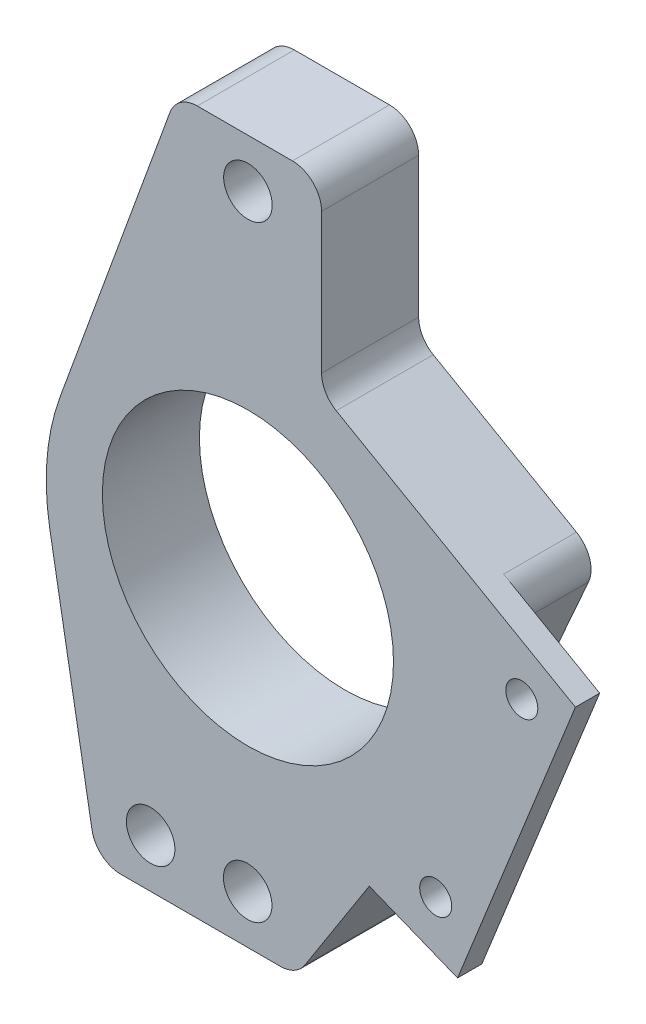
ISO-10303-21;
HEADER;
FILE_DESCRIPTION(('STEP AP214'),'2;1');
FILE_NAME('part.step','',(''),(''),'','','');
FILE_SCHEMA(('AUTOMOTIVE_DESIGN { 1 0 10303 214 1 1 1 1 }'));
ENDSEC;
DATA;
#1=APPLICATION_CONTEXT('core data for automotive mechanical design processes');
#2=APPLICATION_PROTOCOL_DEFINITION('international standard','automotive_design',2000,#1);
#3=PRODUCT_CONTEXT('',#1,'mechanical');
#4=PRODUCT('Part','Part','',(#3));
#5=PRODUCT_RELATED_PRODUCT_CATEGORY('part','',(#4));
#6=PRODUCT_DEFINITION_FORMATION('','',#4);
#7=PRODUCT_DEFINITION_CONTEXT('part definition',#1,'design');
#8=PRODUCT_DEFINITION('design','',#6,#7);
#9=PRODUCT_DEFINITION_SHAPE('','',#8);
#10=(LENGTH_UNIT() NAMED_UNIT(*) SI_UNIT(.MILLI.,.METRE.));
#11=(NAMED_UNIT(*) PLANE_ANGLE_UNIT() SI_UNIT($,.RADIAN.));
#12=(NAMED_UNIT(*) SI_UNIT($,.STERADIAN.) SOLID_ANGLE_UNIT());
#13=UNCERTAINTY_MEASURE_WITH_UNIT(LENGTH_MEASURE(1.E-05),#10,'distance_accuracy_value','');
#14=(GEOMETRIC_REPRESENTATION_CONTEXT(3) GLOBAL_UNCERTAINTY_ASSIGNED_CONTEXT((#13)) GLOBAL_UNIT_ASSIGNED_CONTEXT((#10,
#11,#12)) REPRESENTATION_CONTEXT('',''));
#15=CARTESIAN_POINT('',(0.,0.,0.));
#16=DIRECTION('',(0.,0.,1.));
#17=DIRECTION('',(1.,0.,0.));
#18=AXIS2_PLACEMENT_3D('',#15,#16,#17);
#19=CARTESIAN_POINT('',(7.90346383785839,-4.16941549529396,0.));
#20=DIRECTION('',(0.,0.,1.));
#21=DIRECTION('',(1.,0.,0.));
#22=AXIS2_PLACEMENT_3D('',#19,#20,#21);
#23=PLANE('',#22);
#24=CARTESIAN_POINT('',(-25.4616736797526,-71.0751817515198,0.));
#25=DIRECTION('',(0.,0.,1.));
#26=DIRECTION('',(1.,0.,0.));
#27=AXIS2_PLACEMENT_3D('',#24,#25,#26);
#28=CIRCLE('',#27,6.35);
#29=CARTESIAN_POINT('',(-19.1116736797526,-71.0751817515198,0.));
#30=VERTEX_POINT('',#29);
#31=EDGE_CURVE('E357',#30,#30,#28,.T.);
#32=ORIENTED_EDGE('',*,*,#31,.T.);
#33=EDGE_LOOP('',(#32));
#34=FACE_BOUND('',#33,.T.);
#35=CARTESIAN_POINT('',(0.,87.6652233679311,0.));
#36=DIRECTION('',(0.,0.,1.));
#37=DIRECTION('',(1.,0.,0.));
#38=AXIS2_PLACEMENT_3D('',#35,#36,#37);
#39=CIRCLE('',#38,6.35);
#40=CARTESIAN_POINT('',(6.35,87.6652233679311,0.));
#41=VERTEX_POINT('',#40);
#42=EDGE_CURVE('E351',#41,#41,#39,.T.);
#43=ORIENTED_EDGE('',*,*,#42,.T.);
#44=EDGE_LOOP('',(#43));
#45=FACE_BOUND('',#44,.T.);
#46=CARTESIAN_POINT('',(-0.0616736797525768,-71.0860387192995,0.));
#47=DIRECTION('',(0.,0.,1.));
#48=DIRECTION('',(1.,0.,0.));
#49=AXIS2_PLACEMENT_3D('',#46,#47,#48);
#50=CIRCLE('',#49,6.34999999999999);
#51=CARTESIAN_POINT('',(6.28832632024742,-71.0860387192995,0.));
#52=VERTEX_POINT('',#51);
#53=EDGE_CURVE('E345',#52,#52,#50,.T.);
#54=ORIENTED_EDGE('',*,*,#53,.T.);
#55=EDGE_LOOP('',(#54));
#56=FACE_BOUND('',#55,.T.);
#57=CARTESIAN_POINT('',(0.,0.,0.));
#58=DIRECTION('',(0.,0.,1.));
#59=DIRECTION('',(1.,0.,0.));
#60=AXIS2_PLACEMENT_3D('',#57,#58,#59);
#61=CIRCLE('',#60,38.1);
#62=CARTESIAN_POINT('',(38.1,0.,0.));
#63=VERTEX_POINT('',#62);
#64=EDGE_CURVE('E339',#63,#63,#61,.T.);
#65=ORIENTED_EDGE('',*,*,#64,.T.);
#66=EDGE_LOOP('',(#65));
#67=FACE_BOUND('',#66,.T.);
#68=DIRECTION('',(0.539157704533403,0.842204826418296,0.));
#69=VECTOR('',#68,1.);
#70=CARTESIAN_POINT('',(31.7648995327675,-53.9549633524326,0.));
#71=LINE('',#70,#69);
#72=CARTESIAN_POINT('',(14.9158651693663,-80.274420427844,0.));
#73=VERTEX_POINT('',#72);
#74=CARTESIAN_POINT('',(31.7648995327675,-53.9549633524326,0.));
#75=VERTEX_POINT('',#74);
#76=EDGE_CURVE('E274',#73,#75,#71,.T.);
#77=ORIENTED_EDGE('',*,*,#76,.F.);
#78=CARTESIAN_POINT('',(8.49826439205887,-76.1660387192995,0.));
#79=DIRECTION('',(0.,0.,1.));
#80=DIRECTION('',(1.,0.,0.));
#81=AXIS2_PLACEMENT_3D('',#78,#79,#80);
#82=CIRCLE('',#81,7.62);
#83=CARTESIAN_POINT('',(8.49826439205888,-83.7860387192995,0.));
#84=VERTEX_POINT('',#83);
#85=EDGE_CURVE('E207',#73,#84,#82,.F.);
#86=ORIENTED_EDGE('',*,*,#85,.T.);
#87=DIRECTION('',(1.,0.,0.));
#88=VECTOR('',#87,1.);
#89=CARTESIAN_POINT('',(12.667818141103,-83.7860387192995,0.));
#90=LINE('',#89,#88);
#91=CARTESIAN_POINT('',(-33.3079382069516,-83.7860387192995,0.));
#92=VERTEX_POINT('',#91);
#93=EDGE_CURVE('E292',#92,#84,#90,.T.);
#94=ORIENTED_EDGE('',*,*,#93,.F.);
#95=CARTESIAN_POINT('',(-33.3079382069516,-76.1660387192995,0.));
#96=DIRECTION('',(0.,0.,1.));
#97=DIRECTION('',(1.,0.,0.));
#98=AXIS2_PLACEMENT_3D('',#95,#96,#97);
#99=CIRCLE('',#98,7.62);
#100=CARTESIAN_POINT('',(-40.8125426825424,-77.4871411623152,0.));
#101=VERTEX_POINT('',#100);
#102=EDGE_CURVE('E205',#92,#101,#99,.F.);
#103=ORIENTED_EDGE('',*,*,#102,.T.);
#104=DIRECTION('',(0.173373024017816,-0.984856230392496,0.));
#105=VECTOR('',#104,1.);
#106=CARTESIAN_POINT('',(-39.7036915794758,-83.7860387192995,0.));
#107=LINE('',#106,#105);
#108=CARTESIAN_POINT('',(-51.8670455244235,-14.6913512209726,0.));
#109=VERTEX_POINT('',#108);
#110=EDGE_CURVE('E289',#109,#101,#107,.T.);
#111=ORIENTED_EDGE('',*,*,#110,.F.);
#112=CARTESIAN_POINT('',(7.90346383785839,-4.16941549529396,0.));
#113=DIRECTION('',(0.,0.,1.));
#114=DIRECTION('',(1.,0.,0.));
#115=AXIS2_PLACEMENT_3D('',#112,#113,#114);
#116=CIRCLE('',#115,60.6895783544584);
#117=CARTESIAN_POINT('',(-49.113541670535,16.6220732368237,0.));
#118=VERTEX_POINT('',#117);
#119=EDGE_CURVE('E287',#118,#109,#116,.T.);
#120=ORIENTED_EDGE('',*,*,#119,.F.);
#121=DIRECTION('',(-0.342587463875341,-0.939485939008915,0.));
#122=VECTOR('',#121,1.);
#123=CARTESIAN_POINT('',(-49.113541670535,16.6220732368237,0.));
#124=LINE('',#123,#122);
#125=CARTESIAN_POINT('',(-20.4029819440583,95.3557398426612,0.));
#126=VERTEX_POINT('',#125);
#127=EDGE_CURVE('E285',#126,#118,#124,.T.);
#128=ORIENTED_EDGE('',*,*,#127,.F.);
#129=CARTESIAN_POINT('',(-13.2440990888104,92.7452233679311,0.));
#130=DIRECTION('',(0.,0.,1.));
#131=DIRECTION('',(1.,0.,0.));
#132=AXIS2_PLACEMENT_3D('',#129,#130,#131);
#133=CIRCLE('',#132,7.62);
#134=CARTESIAN_POINT('',(-13.2440990888104,100.365223367931,0.));
#135=VERTEX_POINT('',#134);
#136=EDGE_CURVE('E203',#126,#135,#133,.F.);
#137=ORIENTED_EDGE('',*,*,#136,.T.);
#138=DIRECTION('',(-1.,0.,0.));
#139=VECTOR('',#138,1.);
#140=CARTESIAN_POINT('',(-18.576252894704,100.365223367931,0.));
#141=LINE('',#140,#139);
#142=CARTESIAN_POINT('',(11.6612552260416,100.365223367931,0.));
#143=VERTEX_POINT('',#142);
#144=EDGE_CURVE('E276',#143,#135,#141,.T.);
#145=ORIENTED_EDGE('',*,*,#144,.F.);
#146=CARTESIAN_POINT('',(11.6612552260416,92.7452233679311,0.));
#147=DIRECTION('',(0.,0.,1.));
#148=DIRECTION('',(1.,0.,0.));
#149=AXIS2_PLACEMENT_3D('',#146,#147,#148);
#150=CIRCLE('',#149,7.62);
#151=CARTESIAN_POINT('',(19.2812552260416,92.7452233679311,0.));
#152=VERTEX_POINT('',#151);
#153=EDGE_CURVE('E201',#143,#152,#150,.F.);
#154=ORIENTED_EDGE('',*,*,#153,.T.);
#155=DIRECTION('',(0.,1.,0.));
#156=VECTOR('',#155,1.);
#157=CARTESIAN_POINT('',(19.2812552260416,100.365223367931,0.));
#158=LINE('',#157,#156);
#159=CARTESIAN_POINT('',(19.2812552260416,56.077457914331,0.));
#160=VERTEX_POINT('',#159);
#161=EDGE_CURVE('E271',#160,#152,#158,.T.);
#162=ORIENTED_EDGE('',*,*,#161,.F.);
#163=CARTESIAN_POINT('',(26.9012552260416,56.077457914331,0.));
#164=DIRECTION('',(0.,0.,1.));
#165=DIRECTION('',(1.,0.,0.));
#166=AXIS2_PLACEMENT_3D('',#163,#164,#165);
#167=CIRCLE('',#166,7.62);
#168=CARTESIAN_POINT('',(23.1114699051771,49.4667145959318,0.));
#169=VERTEX_POINT('',#168);
#170=EDGE_CURVE('E242',#160,#169,#167,.T.);
#171=ORIENTED_EDGE('',*,*,#170,.T.);
#172=DIRECTION('',(-0.867551616587824,0.497347154969096,0.));
#173=VECTOR('',#172,1.);
#174=CARTESIAN_POINT('',(19.2812552260416,51.662487547265,0.));
#175=LINE('',#174,#173);
#176=CARTESIAN_POINT('',(60.5795381289079,27.9871429174736,0.));
#177=VERTEX_POINT('',#176);
#178=EDGE_CURVE('E270',#177,#169,#175,.T.);
#179=ORIENTED_EDGE('',*,*,#178,.F.);
#180=CARTESIAN_POINT('',(56.7897528080434,21.3763995990744,0.));
#181=DIRECTION('',(0.,0.,1.));
#182=DIRECTION('',(1.,0.,0.));
#183=AXIS2_PLACEMENT_3D('',#180,#181,#182);
#184=CIRCLE('',#183,7.62);
#185=CARTESIAN_POINT('',(63.7571802893151,18.2910545141253,0.));
#186=VERTEX_POINT('',#185);
#187=EDGE_CURVE('E199',#177,#186,#184,.F.);
#188=ORIENTED_EDGE('',*,*,#187,.T.);
#189=DIRECTION('',(-0.404900929783348,-0.914360561846682,0.));
#190=VECTOR('',#189,1.);
#191=CARTESIAN_POINT('',(66.5381774907985,24.5711936212473,0.));
#192=LINE('',#191,#190);
#193=EDGE_CURVE('E167',#186,#75,#192,.T.);
#194=ORIENTED_EDGE('',*,*,#193,.T.);
#195=EDGE_LOOP('',(#77,#86,#94,#103,#111,#120,#128,#137,#145,#154,#162,#171,#179,#188,#194));
#196=FACE_BOUND('',#195,.T.);
#197=ADVANCED_FACE('F36',(#34,#45,#56,#67,#196),#23,.F.);
#198=CARTESIAN_POINT('',(54.8677317003082,-63.2338089373352,25.4));
#199=DIRECTION('',(0.372696151552018,0.927953435587323,0.));
#200=DIRECTION('',(-0.927953435587323,0.372696151552018,0.));
#201=AXIS2_PLACEMENT_3D('',#198,#199,#200);
#202=PLANE('',#201);
#203=DIRECTION('',(-0.927953435587323,0.372696151552018,0.));
#204=VECTOR('',#203,1.);
#205=CARTESIAN_POINT('',(54.8677317003082,-63.2338089373352,19.05));
#206=LINE('',#205,#204);
#207=CARTESIAN_POINT('',(54.8677317003082,-63.2338089373352,19.05));
#208=VERTEX_POINT('',#207);
#209=CARTESIAN_POINT('',(31.7648995327675,-53.9549633524326,19.05));
#210=VERTEX_POINT('',#209);
#211=EDGE_CURVE('E162',#208,#210,#206,.T.);
#212=ORIENTED_EDGE('',*,*,#211,.F.);
#213=DIRECTION('',(0.,0.,-1.));
#214=VECTOR('',#213,1.);
#215=CARTESIAN_POINT('',(54.8677317003082,-63.2338089373352,25.4));
#216=LINE('',#215,#214);
#217=CARTESIAN_POINT('',(54.8677317003082,-63.2338089373352,25.4));
#218=VERTEX_POINT('',#217);
#219=EDGE_CURVE('E174',#218,#208,#216,.T.);
#220=ORIENTED_EDGE('',*,*,#219,.F.);
#221=DIRECTION('',(0.927953435587323,-0.372696151552018,0.));
#222=VECTOR('',#221,1.);
#223=CARTESIAN_POINT('',(54.8677317003082,-63.2338089373352,25.4));
#224=LINE('',#223,#222);
#225=CARTESIAN_POINT('',(31.7648995327675,-53.9549633524326,25.4));
#226=VERTEX_POINT('',#225);
#227=EDGE_CURVE('E336',#226,#218,#224,.T.);
#228=ORIENTED_EDGE('',*,*,#227,.F.);
#229=DIRECTION('',(0.,0.,-1.));
#230=VECTOR('',#229,1.);
#231=CARTESIAN_POINT('',(31.7648995327675,-53.9549633524326,25.4));
#232=LINE('',#231,#230);
#233=EDGE_CURVE('E177',#226,#210,#232,.T.);
#234=ORIENTED_EDGE('',*,*,#233,.T.);
#235=EDGE_LOOP('',(#212,#220,#228,#234));
#236=FACE_BOUND('',#235,.T.);
#237=ADVANCED_FACE('F172',(#236),#202,.F.);
#238=CARTESIAN_POINT('',(85.7171686846696,13.5763242404886,25.4));
#239=DIRECTION('',(-0.927953435587323,0.372696151552017,0.));
#240=DIRECTION('',(-0.372696151552017,-0.927953435587323,0.));
#241=AXIS2_PLACEMENT_3D('',#238,#239,#240);
#242=PLANE('',#241);
#243=DIRECTION('',(-0.372696151552017,-0.927953435587323,0.));
#244=VECTOR('',#243,1.);
#245=CARTESIAN_POINT('',(85.7171686846696,13.5763242404886,19.05));
#246=LINE('',#245,#244);
#247=CARTESIAN_POINT('',(85.7171686846696,13.5763242404886,19.05));
#248=VERTEX_POINT('',#247);
#249=EDGE_CURVE('E159',#248,#208,#246,.T.);
#250=ORIENTED_EDGE('',*,*,#249,.F.);
#251=DIRECTION('',(0.,0.,-1.));
#252=VECTOR('',#251,1.);
#253=CARTESIAN_POINT('',(85.7171686846696,13.5763242404886,25.4));
#254=LINE('',#253,#252);
#255=CARTESIAN_POINT('',(85.7171686846696,13.5763242404886,25.4));
#256=VERTEX_POINT('',#255);
#257=EDGE_CURVE('E182',#256,#248,#254,.T.);
#258=ORIENTED_EDGE('',*,*,#257,.F.);
#259=DIRECTION('',(0.372696151552017,0.927953435587323,0.));
#260=VECTOR('',#259,1.);
#261=CARTESIAN_POINT('',(85.7171686846696,13.5763242404886,25.4));
#262=LINE('',#261,#260);
#263=EDGE_CURVE('E181',#218,#256,#262,.T.);
#264=ORIENTED_EDGE('',*,*,#263,.F.);
#265=ORIENTED_EDGE('',*,*,#219,.T.);
#266=EDGE_LOOP('',(#250,#258,#264,#265));
#267=FACE_BOUND('',#266,.T.);
#268=ADVANCED_FACE('F180',(#267),#242,.F.);
#269=CARTESIAN_POINT('',(19.2812552260416,51.662487547265,25.4));
#270=DIRECTION('',(-0.497347154969096,-0.867551616587824,0.));
#271=DIRECTION('',(0.867551616587824,-0.497347154969096,0.));
#272=AXIS2_PLACEMENT_3D('',#269,#270,#271);
#273=PLANE('',#272);
#274=ORIENTED_EDGE('',*,*,#178,.T.);
#275=DIRECTION('',(0.,0.,-1.));
#276=VECTOR('',#275,1.);
#277=CARTESIAN_POINT('',(23.1114699051771,49.4667145959318,25.4));
#278=LINE('',#277,#276);
#279=CARTESIAN_POINT('',(23.1114699051771,49.4667145959318,25.4));
#280=VERTEX_POINT('',#279);
#281=EDGE_CURVE('E239',#169,#280,#278,.F.);
#282=ORIENTED_EDGE('',*,*,#281,.T.);
#283=DIRECTION('',(-0.867551616587824,0.497347154969096,0.));
#284=VECTOR('',#283,1.);
#285=CARTESIAN_POINT('',(19.2812552260416,51.662487547265,25.4));
#286=LINE('',#285,#284);
#287=EDGE_CURVE('E254',#256,#280,#286,.T.);
#288=ORIENTED_EDGE('',*,*,#287,.F.);
#289=ORIENTED_EDGE('',*,*,#257,.T.);
#290=DIRECTION('',(-0.867551616587824,0.497347154969096,0.));
#291=VECTOR('',#290,1.);
#292=CARTESIAN_POINT('',(85.7171686846696,13.5763242404886,19.05));
#293=LINE('',#292,#291);
#294=CARTESIAN_POINT('',(60.5795381289079,27.9871429174736,19.05));
#295=VERTEX_POINT('',#294);
#296=EDGE_CURVE('E59',#248,#295,#293,.T.);
#297=ORIENTED_EDGE('',*,*,#296,.T.);
#298=DIRECTION('',(0.,0.,-1.));
#299=VECTOR('',#298,1.);
#300=CARTESIAN_POINT('',(60.5795381289079,27.9871429174736,0.));
#301=LINE('',#300,#299);
#302=EDGE_CURVE('E237',#295,#177,#301,.T.);
#303=ORIENTED_EDGE('',*,*,#302,.T.);
#304=EDGE_LOOP('',(#274,#282,#288,#289,#297,#303));
#305=FACE_BOUND('',#304,.T.);
#306=ADVANCED_FACE('F272',(#305),#273,.F.);
#307=CARTESIAN_POINT('',(7.90346383785839,-4.16941549529396,25.4));
#308=DIRECTION('',(0.,0.,1.));
#309=DIRECTION('',(1.,0.,0.));
#310=AXIS2_PLACEMENT_3D('',#307,#308,#309);
#311=PLANE('',#310);
#312=CARTESIAN_POINT('',(71.679164995877,8.36184835054589,25.4));
#313=DIRECTION('',(0.,0.,1.));
#314=DIRECTION('',(1.,0.,0.));
#315=AXIS2_PLACEMENT_3D('',#312,#313,#314);
#316=CIRCLE('',#315,4.191);
#317=CARTESIAN_POINT('',(75.870164995877,8.36184835054589,25.4));
#318=VERTEX_POINT('',#317);
#319=EDGE_CURVE('E194',#318,#318,#316,.T.);
#320=ORIENTED_EDGE('',*,*,#319,.F.);
#321=EDGE_LOOP('',(#320));
#322=FACE_BOUND('',#321,.T.);
#323=CARTESIAN_POINT('',(49.1489372422544,-47.7347927375789,25.4));
#324=DIRECTION('',(0.,0.,1.));
#325=DIRECTION('',(1.,0.,0.));
#326=AXIS2_PLACEMENT_3D('',#323,#324,#325);
#327=CIRCLE('',#326,4.191);
#328=CARTESIAN_POINT('',(53.3399372422544,-47.7347927375789,25.4));
#329=VERTEX_POINT('',#328);
#330=EDGE_CURVE('E368',#329,#329,#327,.T.);
#331=ORIENTED_EDGE('',*,*,#330,.F.);
#332=EDGE_LOOP('',(#331));
#333=FACE_BOUND('',#332,.T.);
#334=CARTESIAN_POINT('',(0.,87.6652233679311,25.4));
#335=DIRECTION('',(0.,0.,1.));
#336=DIRECTION('',(1.,0.,0.));
#337=AXIS2_PLACEMENT_3D('',#334,#335,#336);
#338=CIRCLE('',#337,6.35);
#339=CARTESIAN_POINT('',(6.35,87.6652233679311,25.4));
#340=VERTEX_POINT('',#339);
#341=EDGE_CURVE('E348',#340,#340,#338,.T.);
#342=ORIENTED_EDGE('',*,*,#341,.F.);
#343=EDGE_LOOP('',(#342));
#344=FACE_BOUND('',#343,.T.);
#345=CARTESIAN_POINT('',(0.,0.,25.4));
#346=DIRECTION('',(0.,0.,1.));
#347=DIRECTION('',(1.,0.,0.));
#348=AXIS2_PLACEMENT_3D('',#345,#346,#347);
#349=CIRCLE('',#348,38.1);
#350=CARTESIAN_POINT('',(38.1,0.,25.4));
#351=VERTEX_POINT('',#350);
#352=EDGE_CURVE('E279',#351,#351,#349,.T.);
#353=ORIENTED_EDGE('',*,*,#352,.F.);
#354=EDGE_LOOP('',(#353));
#355=FACE_BOUND('',#354,.T.);
#356=DIRECTION('',(1.,0.,0.));
#357=VECTOR('',#356,1.);
#358=CARTESIAN_POINT('',(12.667818141103,-83.7860387192995,25.4));
#359=LINE('',#358,#357);
#360=CARTESIAN_POINT('',(-33.3079382069516,-83.7860387192995,25.4));
#361=VERTEX_POINT('',#360);
#362=CARTESIAN_POINT('',(8.49826439205888,-83.7860387192995,25.4));
#363=VERTEX_POINT('',#362);
#364=EDGE_CURVE('E298',#361,#363,#359,.T.);
#365=ORIENTED_EDGE('',*,*,#364,.T.);
#366=CARTESIAN_POINT('',(8.49826439205887,-76.1660387192995,25.4));
#367=DIRECTION('',(0.,0.,1.));
#368=DIRECTION('',(1.,0.,0.));
#369=AXIS2_PLACEMENT_3D('',#366,#367,#368);
#370=CIRCLE('',#369,7.62);
#371=CARTESIAN_POINT('',(14.9158651693663,-80.274420427844,25.4));
#372=VERTEX_POINT('',#371);
#373=EDGE_CURVE('E220',#363,#372,#370,.T.);
#374=ORIENTED_EDGE('',*,*,#373,.T.);
#375=DIRECTION('',(0.539157704533403,0.842204826418296,0.));
#376=VECTOR('',#375,1.);
#377=CARTESIAN_POINT('',(31.7648995327675,-53.9549633524326,25.4));
#378=LINE('',#377,#376);
#379=EDGE_CURVE('E295',#372,#226,#378,.T.);
#380=ORIENTED_EDGE('',*,*,#379,.T.);
#381=ORIENTED_EDGE('',*,*,#227,.T.);
#382=ORIENTED_EDGE('',*,*,#263,.T.);
#383=ORIENTED_EDGE('',*,*,#287,.T.);
#384=CARTESIAN_POINT('',(26.9012552260416,56.077457914331,25.4));
#385=DIRECTION('',(0.,0.,1.));
#386=DIRECTION('',(1.,0.,0.));
#387=AXIS2_PLACEMENT_3D('',#384,#385,#386);
#388=CIRCLE('',#387,7.62);
#389=CARTESIAN_POINT('',(19.2812552260416,56.077457914331,25.4));
#390=VERTEX_POINT('',#389);
#391=EDGE_CURVE('E44',#280,#390,#388,.F.);
#392=ORIENTED_EDGE('',*,*,#391,.T.);
#393=DIRECTION('',(0.,1.,0.));
#394=VECTOR('',#393,1.);
#395=CARTESIAN_POINT('',(19.2812552260416,100.365223367931,25.4));
#396=LINE('',#395,#394);
#397=CARTESIAN_POINT('',(19.2812552260416,92.7452233679311,25.4));
#398=VERTEX_POINT('',#397);
#399=EDGE_CURVE('E251',#390,#398,#396,.T.);
#400=ORIENTED_EDGE('',*,*,#399,.T.);
#401=CARTESIAN_POINT('',(11.6612552260416,92.7452233679311,25.4));
#402=DIRECTION('',(0.,0.,1.));
#403=DIRECTION('',(1.,0.,0.));
#404=AXIS2_PLACEMENT_3D('',#401,#402,#403);
#405=CIRCLE('',#404,7.62);
#406=CARTESIAN_POINT('',(11.6612552260416,100.365223367931,25.4));
#407=VERTEX_POINT('',#406);
#408=EDGE_CURVE('E214',#398,#407,#405,.T.);
#409=ORIENTED_EDGE('',*,*,#408,.T.);
#410=DIRECTION('',(-1.,0.,0.));
#411=VECTOR('',#410,1.);
#412=CARTESIAN_POINT('',(-18.576252894704,100.365223367931,25.4));
#413=LINE('',#412,#411);
#414=CARTESIAN_POINT('',(-13.2440990888104,100.365223367931,25.4));
#415=VERTEX_POINT('',#414);
#416=EDGE_CURVE('E263',#407,#415,#413,.T.);
#417=ORIENTED_EDGE('',*,*,#416,.T.);
#418=CARTESIAN_POINT('',(-13.2440990888104,92.7452233679311,25.4));
#419=DIRECTION('',(0.,0.,1.));
#420=DIRECTION('',(1.,0.,0.));
#421=AXIS2_PLACEMENT_3D('',#418,#419,#420);
#422=CIRCLE('',#421,7.62);
#423=CARTESIAN_POINT('',(-20.4029819440583,95.3557398426612,25.4));
#424=VERTEX_POINT('',#423);
#425=EDGE_CURVE('E216',#415,#424,#422,.T.);
#426=ORIENTED_EDGE('',*,*,#425,.T.);
#427=DIRECTION('',(-0.342587463875341,-0.939485939008915,0.));
#428=VECTOR('',#427,1.);
#429=CARTESIAN_POINT('',(-49.113541670535,16.6220732368237,25.4));
#430=LINE('',#429,#428);
#431=CARTESIAN_POINT('',(-49.113541670535,16.6220732368237,25.4));
#432=VERTEX_POINT('',#431);
#433=EDGE_CURVE('E330',#424,#432,#430,.T.);
#434=ORIENTED_EDGE('',*,*,#433,.T.);
#435=CARTESIAN_POINT('',(7.90346383785839,-4.16941549529396,25.4));
#436=DIRECTION('',(0.,0.,1.));
#437=DIRECTION('',(1.,0.,0.));
#438=AXIS2_PLACEMENT_3D('',#435,#436,#437);
#439=CIRCLE('',#438,60.6895783544584);
#440=CARTESIAN_POINT('',(-51.8670455244235,-14.6913512209726,25.4));
#441=VERTEX_POINT('',#440);
#442=EDGE_CURVE('E306',#432,#441,#439,.T.);
#443=ORIENTED_EDGE('',*,*,#442,.T.);
#444=DIRECTION('',(0.173373024017816,-0.984856230392496,0.));
#445=VECTOR('',#444,1.);
#446=CARTESIAN_POINT('',(-39.7036915794758,-83.7860387192995,25.4));
#447=LINE('',#446,#445);
#448=CARTESIAN_POINT('',(-40.8125426825424,-77.4871411623152,25.4));
#449=VERTEX_POINT('',#448);
#450=EDGE_CURVE('E323',#441,#449,#447,.T.);
#451=ORIENTED_EDGE('',*,*,#450,.T.);
#452=CARTESIAN_POINT('',(-33.3079382069516,-76.1660387192995,25.4));
#453=DIRECTION('',(0.,0.,1.));
#454=DIRECTION('',(1.,0.,0.));
#455=AXIS2_PLACEMENT_3D('',#452,#453,#454);
#456=CIRCLE('',#455,7.62);
#457=EDGE_CURVE('E218',#449,#361,#456,.T.);
#458=ORIENTED_EDGE('',*,*,#457,.T.);
#459=EDGE_LOOP('',(#365,#374,#380,#381,#382,#383,#392,#400,#409,#417,#426,#434,#443,#451,#458));
#460=FACE_BOUND('',#459,.T.);
#461=CARTESIAN_POINT('',(-0.0616736797525768,-71.0860387192995,25.4));
#462=DIRECTION('',(0.,0.,1.));
#463=DIRECTION('',(1.,0.,0.));
#464=AXIS2_PLACEMENT_3D('',#461,#462,#463);
#465=CIRCLE('',#464,6.34999999999999);
#466=CARTESIAN_POINT('',(6.28832632024742,-71.0860387192995,25.4));
#467=VERTEX_POINT('',#466);
#468=EDGE_CURVE('E342',#467,#467,#465,.T.);
#469=ORIENTED_EDGE('',*,*,#468,.F.);
#470=EDGE_LOOP('',(#469));
#471=FACE_BOUND('',#470,.T.);
#472=CARTESIAN_POINT('',(-25.4616736797526,-71.0751817515198,25.4));
#473=DIRECTION('',(0.,0.,1.));
#474=DIRECTION('',(1.,0.,0.));
#475=AXIS2_PLACEMENT_3D('',#472,#473,#474);
#476=CIRCLE('',#475,6.35);
#477=CARTESIAN_POINT('',(-19.1116736797526,-71.0751817515198,25.4));
#478=VERTEX_POINT('',#477);
#479=EDGE_CURVE('E354',#478,#478,#476,.T.);
#480=ORIENTED_EDGE('',*,*,#479,.F.);
#481=EDGE_LOOP('',(#480));
#482=FACE_BOUND('',#481,.T.);
#483=ADVANCED_FACE('F249',(#322,#333,#344,#355,#460,#471,#482),#311,.T.);
#484=CARTESIAN_POINT('',(31.7648995327675,-53.9549633524326,25.4));
#485=DIRECTION('',(-0.842204826418296,0.539157704533403,0.));
#486=DIRECTION('',(-0.539157704533403,-0.842204826418296,0.));
#487=AXIS2_PLACEMENT_3D('',#484,#485,#486);
#488=PLANE('',#487);
#489=ORIENTED_EDGE('',*,*,#379,.F.);
#490=DIRECTION('',(0.,0.,-1.));
#491=VECTOR('',#490,1.);
#492=CARTESIAN_POINT('',(14.9158651693663,-80.274420427844,25.4));
#493=LINE('',#492,#491);
#494=EDGE_CURVE('E184',#372,#73,#493,.T.);
#495=ORIENTED_EDGE('',*,*,#494,.T.);
#496=ORIENTED_EDGE('',*,*,#76,.T.);
#497=DIRECTION('',(0.,0.,-1.));
#498=VECTOR('',#497,1.);
#499=CARTESIAN_POINT('',(31.7648995327675,-53.9549633524326,19.05));
#500=LINE('',#499,#498);
#501=EDGE_CURVE('E360',#210,#75,#500,.T.);
#502=ORIENTED_EDGE('',*,*,#501,.F.);
#503=ORIENTED_EDGE('',*,*,#233,.F.);
#504=EDGE_LOOP('',(#489,#495,#496,#502,#503));
#505=FACE_BOUND('',#504,.T.);
#506=ADVANCED_FACE('F378',(#505),#488,.F.);
#507=CARTESIAN_POINT('',(19.2812552260416,100.365223367931,25.4));
#508=DIRECTION('',(-1.,0.,0.));
#509=DIRECTION('',(0.,-1.,0.));
#510=AXIS2_PLACEMENT_3D('',#507,#508,#509);
#511=PLANE('',#510);
#512=ORIENTED_EDGE('',*,*,#161,.T.);
#513=DIRECTION('',(0.,0.,-1.));
#514=VECTOR('',#513,1.);
#515=CARTESIAN_POINT('',(19.2812552260416,92.7452233679311,25.4));
#516=LINE('',#515,#514);
#517=EDGE_CURVE('E235',#152,#398,#516,.F.);
#518=ORIENTED_EDGE('',*,*,#517,.T.);
#519=ORIENTED_EDGE('',*,*,#399,.F.);
#520=DIRECTION('',(0.,0.,-1.));
#521=VECTOR('',#520,1.);
#522=CARTESIAN_POINT('',(19.2812552260416,56.077457914331,0.));
#523=LINE('',#522,#521);
#524=EDGE_CURVE('E232',#390,#160,#523,.T.);
#525=ORIENTED_EDGE('',*,*,#524,.T.);
#526=EDGE_LOOP('',(#512,#518,#519,#525));
#527=FACE_BOUND('',#526,.T.);
#528=ADVANCED_FACE('F260',(#527),#511,.F.);
#529=CARTESIAN_POINT('',(-18.576252894704,100.365223367931,25.4));
#530=DIRECTION('',(0.,-1.,0.));
#531=DIRECTION('',(0.,0.,-1.));
#532=AXIS2_PLACEMENT_3D('',#529,#530,#531);
#533=PLANE('',#532);
#534=ORIENTED_EDGE('',*,*,#144,.T.);
#535=DIRECTION('',(0.,0.,-1.));
#536=VECTOR('',#535,1.);
#537=CARTESIAN_POINT('',(-13.2440990888104,100.365223367931,25.4));
#538=LINE('',#537,#536);
#539=EDGE_CURVE('E230',#135,#415,#538,.F.);
#540=ORIENTED_EDGE('',*,*,#539,.T.);
#541=ORIENTED_EDGE('',*,*,#416,.F.);
#542=DIRECTION('',(0.,0.,-1.));
#543=VECTOR('',#542,1.);
#544=CARTESIAN_POINT('',(11.6612552260416,100.365223367931,25.4));
#545=LINE('',#544,#543);
#546=EDGE_CURVE('E227',#407,#143,#545,.T.);
#547=ORIENTED_EDGE('',*,*,#546,.T.);
#548=EDGE_LOOP('',(#534,#540,#541,#547));
#549=FACE_BOUND('',#548,.T.);
#550=ADVANCED_FACE('F411',(#549),#533,.F.);
#551=CARTESIAN_POINT('',(-49.113541670535,16.6220732368237,25.4));
#552=DIRECTION('',(0.939485939008915,-0.342587463875341,0.));
#553=DIRECTION('',(0.342587463875341,0.939485939008915,0.));
#554=AXIS2_PLACEMENT_3D('',#551,#552,#553);
#555=PLANE('',#554);
#556=ORIENTED_EDGE('',*,*,#433,.F.);
#557=DIRECTION('',(0.,0.,-1.));
#558=VECTOR('',#557,1.);
#559=CARTESIAN_POINT('',(-20.4029819440583,95.3557398426613,25.4));
#560=LINE('',#559,#558);
#561=EDGE_CURVE('E224',#424,#126,#560,.T.);
#562=ORIENTED_EDGE('',*,*,#561,.T.);
#563=ORIENTED_EDGE('',*,*,#127,.T.);
#564=DIRECTION('',(0.,0.,-1.));
#565=VECTOR('',#564,1.);
#566=CARTESIAN_POINT('',(-49.113541670535,16.6220732368237,25.4));
#567=LINE('',#566,#565);
#568=EDGE_CURVE('E186',#432,#118,#567,.T.);
#569=ORIENTED_EDGE('',*,*,#568,.F.);
#570=EDGE_LOOP('',(#556,#562,#563,#569));
#571=FACE_BOUND('',#570,.T.);
#572=ADVANCED_FACE('F408',(#571),#555,.F.);
#573=CARTESIAN_POINT('',(7.90346383785839,-4.16941549529396,25.4));
#574=DIRECTION('',(0.,0.,-1.));
#575=DIRECTION('',(-1.,0.,0.));
#576=AXIS2_PLACEMENT_3D('',#573,#574,#575);
#577=CYLINDRICAL_SURFACE('',#576,60.6895783544584);
#578=ORIENTED_EDGE('',*,*,#119,.T.);
#579=DIRECTION('',(0.,0.,-1.));
#580=VECTOR('',#579,1.);
#581=CARTESIAN_POINT('',(-51.8670455244235,-14.6913512209726,25.4));
#582=LINE('',#581,#580);
#583=EDGE_CURVE('E296',#441,#109,#582,.T.);
#584=ORIENTED_EDGE('',*,*,#583,.F.);
#585=ORIENTED_EDGE('',*,*,#442,.F.);
#586=ORIENTED_EDGE('',*,*,#568,.T.);
#587=EDGE_LOOP('',(#578,#584,#585,#586));
#588=FACE_BOUND('',#587,.T.);
#589=ADVANCED_FACE('F304',(#588),#577,.T.);
#590=CARTESIAN_POINT('',(-39.7036915794758,-83.7860387192995,25.4));
#591=DIRECTION('',(0.984856230392496,0.173373024017816,0.));
#592=DIRECTION('',(-0.173373024017816,0.984856230392496,0.));
#593=AXIS2_PLACEMENT_3D('',#590,#591,#592);
#594=PLANE('',#593);
#595=ORIENTED_EDGE('',*,*,#110,.T.);
#596=DIRECTION('',(0.,0.,-1.));
#597=VECTOR('',#596,1.);
#598=CARTESIAN_POINT('',(-40.8125426825424,-77.4871411623152,25.4));
#599=LINE('',#598,#597);
#600=EDGE_CURVE('E222',#101,#449,#599,.F.);
#601=ORIENTED_EDGE('',*,*,#600,.T.);
#602=ORIENTED_EDGE('',*,*,#450,.F.);
#603=ORIENTED_EDGE('',*,*,#583,.T.);
#604=EDGE_LOOP('',(#595,#601,#602,#603));
#605=FACE_BOUND('',#604,.T.);
#606=ADVANCED_FACE('F314',(#605),#594,.F.);
#607=CARTESIAN_POINT('',(12.667818141103,-83.7860387192995,25.4));
#608=DIRECTION('',(0.,1.,0.));
#609=DIRECTION('',(-1.,0.,0.));
#610=AXIS2_PLACEMENT_3D('',#607,#608,#609);
#611=PLANE('',#610);
#612=ORIENTED_EDGE('',*,*,#93,.T.);
#613=DIRECTION('',(0.,0.,-1.));
#614=VECTOR('',#613,1.);
#615=CARTESIAN_POINT('',(8.49826439205887,-83.7860387192995,25.4));
#616=LINE('',#615,#614);
#617=EDGE_CURVE('E212',#84,#363,#616,.F.);
#618=ORIENTED_EDGE('',*,*,#617,.T.);
#619=ORIENTED_EDGE('',*,*,#364,.F.);
#620=DIRECTION('',(0.,0.,-1.));
#621=VECTOR('',#620,1.);
#622=CARTESIAN_POINT('',(-33.3079382069516,-83.7860387192995,25.4));
#623=LINE('',#622,#621);
#624=EDGE_CURVE('E209',#361,#92,#623,.T.);
#625=ORIENTED_EDGE('',*,*,#624,.T.);
#626=EDGE_LOOP('',(#612,#618,#619,#625));
#627=FACE_BOUND('',#626,.T.);
#628=ADVANCED_FACE('F325',(#627),#611,.F.);
#629=CARTESIAN_POINT('',(0.,0.,25.4));
#630=DIRECTION('',(0.,0.,-1.));
#631=DIRECTION('',(-1.,0.,0.));
#632=AXIS2_PLACEMENT_3D('',#629,#630,#631);
#633=CYLINDRICAL_SURFACE('',#632,38.1);
#634=ORIENTED_EDGE('',*,*,#352,.T.);
#635=EDGE_LOOP('',(#634));
#636=FACE_BOUND('',#635,.T.);
#637=ORIENTED_EDGE('',*,*,#64,.F.);
#638=EDGE_LOOP('',(#637));
#639=FACE_BOUND('',#638,.T.);
#640=ADVANCED_FACE('F386',(#636,#639),#633,.F.);
#641=CARTESIAN_POINT('',(-0.0616736797525768,-71.0860387192995,25.4));
#642=DIRECTION('',(0.,0.,-1.));
#643=DIRECTION('',(-1.,0.,0.));
#644=AXIS2_PLACEMENT_3D('',#641,#642,#643);
#645=CYLINDRICAL_SURFACE('',#644,6.34999999999999);
#646=ORIENTED_EDGE('',*,*,#468,.T.);
#647=EDGE_LOOP('',(#646));
#648=FACE_BOUND('',#647,.T.);
#649=ORIENTED_EDGE('',*,*,#53,.F.);
#650=EDGE_LOOP('',(#649));
#651=FACE_BOUND('',#650,.T.);
#652=ADVANCED_FACE('F389',(#648,#651),#645,.F.);
#653=CARTESIAN_POINT('',(0.,87.6652233679311,25.4));
#654=DIRECTION('',(0.,0.,-1.));
#655=DIRECTION('',(-1.,0.,0.));
#656=AXIS2_PLACEMENT_3D('',#653,#654,#655);
#657=CYLINDRICAL_SURFACE('',#656,6.35);
#658=ORIENTED_EDGE('',*,*,#341,.T.);
#659=EDGE_LOOP('',(#658));
#660=FACE_BOUND('',#659,.T.);
#661=ORIENTED_EDGE('',*,*,#42,.F.);
#662=EDGE_LOOP('',(#661));
#663=FACE_BOUND('',#662,.T.);
#664=ADVANCED_FACE('F458',(#660,#663),#657,.F.);
#665=CARTESIAN_POINT('',(-25.4616736797526,-71.0751817515198,25.4));
#666=DIRECTION('',(0.,0.,-1.));
#667=DIRECTION('',(-1.,0.,0.));
#668=AXIS2_PLACEMENT_3D('',#665,#666,#667);
#669=CYLINDRICAL_SURFACE('',#668,6.35);
#670=ORIENTED_EDGE('',*,*,#479,.T.);
#671=EDGE_LOOP('',(#670));
#672=FACE_BOUND('',#671,.T.);
#673=ORIENTED_EDGE('',*,*,#31,.F.);
#674=EDGE_LOOP('',(#673));
#675=FACE_BOUND('',#674,.T.);
#676=ADVANCED_FACE('F449',(#672,#675),#669,.F.);
#677=CARTESIAN_POINT('',(66.5381774907985,24.5711936212473,19.05));
#678=DIRECTION('',(0.914360561846682,-0.404900929783348,0.));
#679=DIRECTION('',(0.404900929783348,0.914360561846682,0.));
#680=AXIS2_PLACEMENT_3D('',#677,#678,#679);
#681=PLANE('',#680);
#682=ORIENTED_EDGE('',*,*,#193,.F.);
#683=DIRECTION('',(0.,0.,-1.));
#684=VECTOR('',#683,1.);
#685=CARTESIAN_POINT('',(63.7571802893151,18.2910545141253,19.05));
#686=LINE('',#685,#684);
#687=CARTESIAN_POINT('',(63.7571802893151,18.2910545141253,19.05));
#688=VERTEX_POINT('',#687);
#689=EDGE_CURVE('E51',#186,#688,#686,.F.);
#690=ORIENTED_EDGE('',*,*,#689,.T.);
#691=DIRECTION('',(-0.404900929783348,-0.914360561846682,0.));
#692=VECTOR('',#691,1.);
#693=CARTESIAN_POINT('',(66.5381774907985,24.5711936212473,19.05));
#694=LINE('',#693,#692);
#695=EDGE_CURVE('E178',#688,#210,#694,.T.);
#696=ORIENTED_EDGE('',*,*,#695,.T.);
#697=ORIENTED_EDGE('',*,*,#501,.T.);
#698=EDGE_LOOP('',(#682,#690,#696,#697));
#699=FACE_BOUND('',#698,.T.);
#700=ADVANCED_FACE('F445',(#699),#681,.T.);
#701=CARTESIAN_POINT('',(0.,0.,19.05));
#702=DIRECTION('',(0.,0.,-1.));
#703=DIRECTION('',(-1.,0.,0.));
#704=AXIS2_PLACEMENT_3D('',#701,#702,#703);
#705=PLANE('',#704);
#706=CARTESIAN_POINT('',(71.679164995877,8.36184835054589,19.05));
#707=DIRECTION('',(0.,0.,-1.));
#708=DIRECTION('',(-1.,0.,0.));
#709=AXIS2_PLACEMENT_3D('',#706,#707,#708);
#710=CIRCLE('',#709,4.191);
#711=CARTESIAN_POINT('',(67.488164995877,8.36184835054589,19.05));
#712=VERTEX_POINT('',#711);
#713=EDGE_CURVE('E193',#712,#712,#710,.T.);
#714=ORIENTED_EDGE('',*,*,#713,.F.);
#715=EDGE_LOOP('',(#714));
#716=FACE_BOUND('',#715,.T.);
#717=CARTESIAN_POINT('',(49.1489372422544,-47.7347927375789,19.05));
#718=DIRECTION('',(0.,0.,-1.));
#719=DIRECTION('',(-1.,0.,0.));
#720=AXIS2_PLACEMENT_3D('',#717,#718,#719);
#721=CIRCLE('',#720,4.191);
#722=CARTESIAN_POINT('',(44.9579372422544,-47.7347927375789,19.05));
#723=VERTEX_POINT('',#722);
#724=EDGE_CURVE('E190',#723,#723,#721,.T.);
#725=ORIENTED_EDGE('',*,*,#724,.F.);
#726=EDGE_LOOP('',(#725));
#727=FACE_BOUND('',#726,.T.);
#728=ORIENTED_EDGE('',*,*,#249,.T.);
#729=ORIENTED_EDGE('',*,*,#211,.T.);
#730=ORIENTED_EDGE('',*,*,#695,.F.);
#731=CARTESIAN_POINT('',(56.7897528080434,21.3763995990744,19.05));
#732=DIRECTION('',(0.,0.,-1.));
#733=DIRECTION('',(-1.,0.,0.));
#734=AXIS2_PLACEMENT_3D('',#731,#732,#733);
#735=CIRCLE('',#734,7.62);
#736=EDGE_CURVE('E11',#688,#295,#735,.F.);
#737=ORIENTED_EDGE('',*,*,#736,.T.);
#738=ORIENTED_EDGE('',*,*,#296,.F.);
#739=EDGE_LOOP('',(#728,#729,#730,#737,#738));
#740=FACE_BOUND('',#739,.T.);
#741=ADVANCED_FACE('F161',(#716,#727,#740),#705,.T.);
#742=CARTESIAN_POINT('',(49.1489372422544,-47.7347927375789,0.));
#743=DIRECTION('',(0.,0.,1.));
#744=DIRECTION('',(1.,0.,0.));
#745=AXIS2_PLACEMENT_3D('',#742,#743,#744);
#746=CYLINDRICAL_SURFACE('',#745,4.191);
#747=ORIENTED_EDGE('',*,*,#724,.T.);
#748=EDGE_LOOP('',(#747));
#749=FACE_BOUND('',#748,.T.);
#750=ORIENTED_EDGE('',*,*,#330,.T.);
#751=EDGE_LOOP('',(#750));
#752=FACE_BOUND('',#751,.T.);
#753=ADVANCED_FACE('F455',(#749,#752),#746,.F.);
#754=CARTESIAN_POINT('',(71.679164995877,8.36184835054589,0.));
#755=DIRECTION('',(0.,0.,1.));
#756=DIRECTION('',(1.,0.,0.));
#757=AXIS2_PLACEMENT_3D('',#754,#755,#756);
#758=CYLINDRICAL_SURFACE('',#757,4.191);
#759=ORIENTED_EDGE('',*,*,#713,.T.);
#760=EDGE_LOOP('',(#759));
#761=FACE_BOUND('',#760,.T.);
#762=ORIENTED_EDGE('',*,*,#319,.T.);
#763=EDGE_LOOP('',(#762));
#764=FACE_BOUND('',#763,.T.);
#765=ADVANCED_FACE('F374',(#761,#764),#758,.F.);
#766=CARTESIAN_POINT('',(8.49826439205887,-76.1660387192995,25.4));
#767=DIRECTION('',(0.,0.,-1.));
#768=DIRECTION('',(-1.,0.,0.));
#769=AXIS2_PLACEMENT_3D('',#766,#767,#768);
#770=CYLINDRICAL_SURFACE('',#769,7.62);
#771=ORIENTED_EDGE('',*,*,#373,.F.);
#772=ORIENTED_EDGE('',*,*,#617,.F.);
#773=ORIENTED_EDGE('',*,*,#85,.F.);
#774=ORIENTED_EDGE('',*,*,#494,.F.);
#775=EDGE_LOOP('',(#771,#772,#773,#774));
#776=FACE_BOUND('',#775,.T.);
#777=ADVANCED_FACE('F424',(#776),#770,.T.);
#778=CARTESIAN_POINT('',(-33.3079382069516,-76.1660387192995,25.4));
#779=DIRECTION('',(0.,0.,-1.));
#780=DIRECTION('',(-1.,0.,0.));
#781=AXIS2_PLACEMENT_3D('',#778,#779,#780);
#782=CYLINDRICAL_SURFACE('',#781,7.62);
#783=ORIENTED_EDGE('',*,*,#457,.F.);
#784=ORIENTED_EDGE('',*,*,#600,.F.);
#785=ORIENTED_EDGE('',*,*,#102,.F.);
#786=ORIENTED_EDGE('',*,*,#624,.F.);
#787=EDGE_LOOP('',(#783,#784,#785,#786));
#788=FACE_BOUND('',#787,.T.);
#789=ADVANCED_FACE('F319',(#788),#782,.T.);
#790=CARTESIAN_POINT('',(-13.2440990888104,92.7452233679311,25.4));
#791=DIRECTION('',(0.,0.,-1.));
#792=DIRECTION('',(-1.,0.,0.));
#793=AXIS2_PLACEMENT_3D('',#790,#791,#792);
#794=CYLINDRICAL_SURFACE('',#793,7.62);
#795=ORIENTED_EDGE('',*,*,#425,.F.);
#796=ORIENTED_EDGE('',*,*,#539,.F.);
#797=ORIENTED_EDGE('',*,*,#136,.F.);
#798=ORIENTED_EDGE('',*,*,#561,.F.);
#799=EDGE_LOOP('',(#795,#796,#797,#798));
#800=FACE_BOUND('',#799,.T.);
#801=ADVANCED_FACE('F430',(#800),#794,.T.);
#802=CARTESIAN_POINT('',(11.6612552260416,92.7452233679311,25.4));
#803=DIRECTION('',(0.,0.,-1.));
#804=DIRECTION('',(-1.,0.,0.));
#805=AXIS2_PLACEMENT_3D('',#802,#803,#804);
#806=CYLINDRICAL_SURFACE('',#805,7.62);
#807=ORIENTED_EDGE('',*,*,#408,.F.);
#808=ORIENTED_EDGE('',*,*,#517,.F.);
#809=ORIENTED_EDGE('',*,*,#153,.F.);
#810=ORIENTED_EDGE('',*,*,#546,.F.);
#811=EDGE_LOOP('',(#807,#808,#809,#810));
#812=FACE_BOUND('',#811,.T.);
#813=ADVANCED_FACE('F433',(#812),#806,.T.);
#814=CARTESIAN_POINT('',(26.9012552260416,56.077457914331,25.4));
#815=DIRECTION('',(0.,0.,1.));
#816=DIRECTION('',(1.,0.,0.));
#817=AXIS2_PLACEMENT_3D('',#814,#815,#816);
#818=CYLINDRICAL_SURFACE('',#817,7.62);
#819=ORIENTED_EDGE('',*,*,#391,.F.);
#820=ORIENTED_EDGE('',*,*,#281,.F.);
#821=ORIENTED_EDGE('',*,*,#170,.F.);
#822=ORIENTED_EDGE('',*,*,#524,.F.);
#823=EDGE_LOOP('',(#819,#820,#821,#822));
#824=FACE_BOUND('',#823,.T.);
#825=ADVANCED_FACE('F265',(#824),#818,.F.);
#826=CARTESIAN_POINT('',(56.7897528080434,21.3763995990744,25.4));
#827=DIRECTION('',(0.,0.,1.));
#828=DIRECTION('',(1.,0.,0.));
#829=AXIS2_PLACEMENT_3D('',#826,#827,#828);
#830=CYLINDRICAL_SURFACE('',#829,7.62);
#831=ORIENTED_EDGE('',*,*,#736,.F.);
#832=ORIENTED_EDGE('',*,*,#689,.F.);
#833=ORIENTED_EDGE('',*,*,#187,.F.);
#834=ORIENTED_EDGE('',*,*,#302,.F.);
#835=EDGE_LOOP('',(#831,#832,#833,#834));
#836=FACE_BOUND('',#835,.T.);
#837=ADVANCED_FACE('F38',(#836),#830,.T.);
#838=CLOSED_SHELL('',(#197,#237,#268,#306,#483,#506,#528,#550,#572,#589,#606,#628,#640,#652,
#664,#676,#700,#741,#753,#765,#777,#789,#801,#813,#825,#837));
#839=MANIFOLD_SOLID_BREP('B2',#838);
#840=ADVANCED_BREP_SHAPE_REPRESENTATION('',(#18,#839),#14);
#841=SHAPE_DEFINITION_REPRESENTATION(#9,#840);
ENDSEC;
END-ISO-10303-21;
